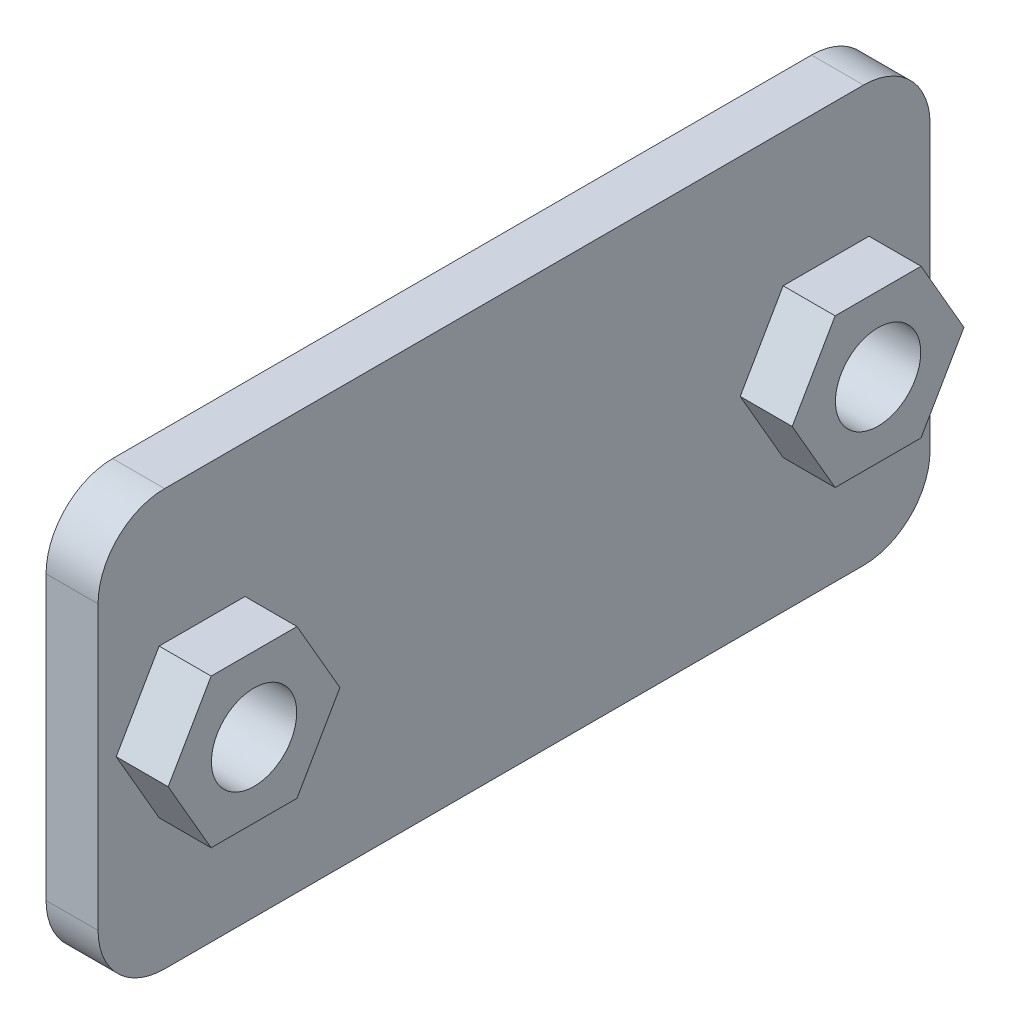
ISO-10303-21;
HEADER;
FILE_DESCRIPTION(('STEP AP214'),'2;1');
FILE_NAME('part.step','',(''),(''),'','','');
FILE_SCHEMA(('AUTOMOTIVE_DESIGN { 1 0 10303 214 1 1 1 1 }'));
ENDSEC;
DATA;
#1=APPLICATION_CONTEXT('core data for automotive mechanical design processes');
#2=APPLICATION_PROTOCOL_DEFINITION('international standard','automotive_design',2000,#1);
#3=PRODUCT_CONTEXT('',#1,'mechanical');
#4=PRODUCT('Part','Part','',(#3));
#5=PRODUCT_RELATED_PRODUCT_CATEGORY('part','',(#4));
#6=PRODUCT_DEFINITION_FORMATION('','',#4);
#7=PRODUCT_DEFINITION_CONTEXT('part definition',#1,'design');
#8=PRODUCT_DEFINITION('design','',#6,#7);
#9=PRODUCT_DEFINITION_SHAPE('','',#8);
#10=(LENGTH_UNIT() NAMED_UNIT(*) SI_UNIT(.MILLI.,.METRE.));
#11=(NAMED_UNIT(*) PLANE_ANGLE_UNIT() SI_UNIT($,.RADIAN.));
#12=(NAMED_UNIT(*) SI_UNIT($,.STERADIAN.) SOLID_ANGLE_UNIT());
#13=UNCERTAINTY_MEASURE_WITH_UNIT(LENGTH_MEASURE(1.E-05),#10,'distance_accuracy_value','');
#14=(GEOMETRIC_REPRESENTATION_CONTEXT(3) GLOBAL_UNCERTAINTY_ASSIGNED_CONTEXT((#13)) GLOBAL_UNIT_ASSIGNED_CONTEXT((#10,
#11,#12)) REPRESENTATION_CONTEXT('',''));
#15=CARTESIAN_POINT('',(0.,0.,0.));
#16=DIRECTION('',(0.,0.,1.));
#17=DIRECTION('',(1.,0.,0.));
#18=AXIS2_PLACEMENT_3D('',#15,#16,#17);
#19=CARTESIAN_POINT('',(5.,0.,0.));
#20=DIRECTION('',(1.,0.,0.));
#21=DIRECTION('',(0.,0.,-1.));
#22=AXIS2_PLACEMENT_3D('',#19,#20,#21);
#23=PLANE('',#22);
#24=DIRECTION('',(0.,0.866025403784439,0.5));
#25=VECTOR('',#24,1.);
#26=CARTESIAN_POINT('',(5.,0.,21.7438911505884));
#27=LINE('',#26,#25);
#28=CARTESIAN_POINT('',(5.,0.,21.7438911505884));
#29=VERTEX_POINT('',#28);
#30=CARTESIAN_POINT('',(5.,7.15000000000001,25.8719455752942));
#31=VERTEX_POINT('',#30);
#32=EDGE_CURVE('E200',#29,#31,#27,.T.);
#33=ORIENTED_EDGE('',*,*,#32,.F.);
#34=DIRECTION('',(0.,0.866025403784439,-0.5));
#35=VECTOR('',#34,1.);
#36=CARTESIAN_POINT('',(5.,-7.15,25.8719455752942));
#37=LINE('',#36,#35);
#38=CARTESIAN_POINT('',(5.,-7.15,25.8719455752942));
#39=VERTEX_POINT('',#38);
#40=EDGE_CURVE('E197',#39,#29,#37,.T.);
#41=ORIENTED_EDGE('',*,*,#40,.F.);
#42=DIRECTION('',(0.,0.,-1.));
#43=VECTOR('',#42,1.);
#44=CARTESIAN_POINT('',(5.,-7.15,34.1280544247058));
#45=LINE('',#44,#43);
#46=CARTESIAN_POINT('',(5.,-7.15,34.1280544247058));
#47=VERTEX_POINT('',#46);
#48=EDGE_CURVE('E210',#47,#39,#45,.T.);
#49=ORIENTED_EDGE('',*,*,#48,.F.);
#50=DIRECTION('',(0.,-0.866025403784439,-0.5));
#51=VECTOR('',#50,1.);
#52=CARTESIAN_POINT('',(5.,0.,38.2561088494116));
#53=LINE('',#52,#51);
#54=CARTESIAN_POINT('',(5.,0.,38.2561088494116));
#55=VERTEX_POINT('',#54);
#56=EDGE_CURVE('E226',#55,#47,#53,.T.);
#57=ORIENTED_EDGE('',*,*,#56,.F.);
#58=DIRECTION('',(0.,-0.866025403784439,0.5));
#59=VECTOR('',#58,1.);
#60=CARTESIAN_POINT('',(5.,7.15000000000001,34.1280544247058));
#61=LINE('',#60,#59);
#62=CARTESIAN_POINT('',(5.,7.15000000000001,34.1280544247058));
#63=VERTEX_POINT('',#62);
#64=EDGE_CURVE('E224',#63,#55,#61,.T.);
#65=ORIENTED_EDGE('',*,*,#64,.F.);
#66=DIRECTION('',(0.,0.,1.));
#67=VECTOR('',#66,1.);
#68=CARTESIAN_POINT('',(5.,7.15000000000001,25.8719455752942));
#69=LINE('',#68,#67);
#70=EDGE_CURVE('E222',#31,#63,#69,.T.);
#71=ORIENTED_EDGE('',*,*,#70,.F.);
#72=EDGE_LOOP('',(#33,#41,#49,#57,#65,#71));
#73=FACE_BOUND('',#72,.T.);
#74=DIRECTION('',(0.,1.,0.));
#75=VECTOR('',#74,1.);
#76=CARTESIAN_POINT('',(5.,20.,-40.));
#77=LINE('',#76,#75);
#78=CARTESIAN_POINT('',(5.,-13.6,-40.));
#79=VERTEX_POINT('',#78);
#80=CARTESIAN_POINT('',(5.,13.6,-40.));
#81=VERTEX_POINT('',#80);
#82=EDGE_CURVE('E244',#79,#81,#77,.T.);
#83=ORIENTED_EDGE('',*,*,#82,.T.);
#84=CARTESIAN_POINT('',(5.,13.6,-33.6));
#85=DIRECTION('',(1.,0.,0.));
#86=DIRECTION('',(0.,0.,-1.));
#87=AXIS2_PLACEMENT_3D('',#84,#85,#86);
#88=CIRCLE('',#87,6.4);
#89=CARTESIAN_POINT('',(5.,20.,-33.6));
#90=VERTEX_POINT('',#89);
#91=EDGE_CURVE('E293',#81,#90,#88,.T.);
#92=ORIENTED_EDGE('',*,*,#91,.T.);
#93=DIRECTION('',(0.,0.,1.));
#94=VECTOR('',#93,1.);
#95=CARTESIAN_POINT('',(5.,20.,40.));
#96=LINE('',#95,#94);
#97=CARTESIAN_POINT('',(5.,20.,33.6));
#98=VERTEX_POINT('',#97);
#99=EDGE_CURVE('E247',#90,#98,#96,.T.);
#100=ORIENTED_EDGE('',*,*,#99,.T.);
#101=CARTESIAN_POINT('',(5.,13.6,33.6));
#102=DIRECTION('',(1.,0.,0.));
#103=DIRECTION('',(0.,0.,-1.));
#104=AXIS2_PLACEMENT_3D('',#101,#102,#103);
#105=CIRCLE('',#104,6.4);
#106=CARTESIAN_POINT('',(5.,13.6,40.));
#107=VERTEX_POINT('',#106);
#108=EDGE_CURVE('E287',#98,#107,#105,.T.);
#109=ORIENTED_EDGE('',*,*,#108,.T.);
#110=DIRECTION('',(0.,-1.,0.));
#111=VECTOR('',#110,1.);
#112=CARTESIAN_POINT('',(5.,20.,40.));
#113=LINE('',#112,#111);
#114=CARTESIAN_POINT('',(5.,-13.6,40.));
#115=VERTEX_POINT('',#114);
#116=EDGE_CURVE('E251',#107,#115,#113,.T.);
#117=ORIENTED_EDGE('',*,*,#116,.T.);
#118=CARTESIAN_POINT('',(5.,-13.6,33.6));
#119=DIRECTION('',(1.,0.,0.));
#120=DIRECTION('',(0.,0.,-1.));
#121=AXIS2_PLACEMENT_3D('',#118,#119,#120);
#122=CIRCLE('',#121,6.4);
#123=CARTESIAN_POINT('',(5.,-20.,33.6));
#124=VERTEX_POINT('',#123);
#125=EDGE_CURVE('E289',#115,#124,#122,.T.);
#126=ORIENTED_EDGE('',*,*,#125,.T.);
#127=DIRECTION('',(0.,0.,-1.));
#128=VECTOR('',#127,1.);
#129=CARTESIAN_POINT('',(5.,-20.,40.));
#130=LINE('',#129,#128);
#131=CARTESIAN_POINT('',(5.,-20.,-33.6));
#132=VERTEX_POINT('',#131);
#133=EDGE_CURVE('E254',#124,#132,#130,.T.);
#134=ORIENTED_EDGE('',*,*,#133,.T.);
#135=CARTESIAN_POINT('',(5.,-13.6,-33.6));
#136=DIRECTION('',(1.,0.,0.));
#137=DIRECTION('',(0.,0.,-1.));
#138=AXIS2_PLACEMENT_3D('',#135,#136,#137);
#139=CIRCLE('',#138,6.4);
#140=EDGE_CURVE('E291',#132,#79,#139,.T.);
#141=ORIENTED_EDGE('',*,*,#140,.T.);
#142=EDGE_LOOP('',(#83,#92,#100,#109,#117,#126,#134,#141));
#143=FACE_BOUND('',#142,.T.);
#144=DIRECTION('',(0.,-0.866025403784439,-0.5));
#145=VECTOR('',#144,1.);
#146=CARTESIAN_POINT('',(5.,0.,-21.7438911505884));
#147=LINE('',#146,#145);
#148=CARTESIAN_POINT('',(5.,0.,-21.7438911505884));
#149=VERTEX_POINT('',#148);
#150=CARTESIAN_POINT('',(5.,-7.15,-25.8719455752942));
#151=VERTEX_POINT('',#150);
#152=EDGE_CURVE('E312',#149,#151,#147,.T.);
#153=ORIENTED_EDGE('',*,*,#152,.F.);
#154=DIRECTION('',(0.,-0.866025403784439,0.499999999999999));
#155=VECTOR('',#154,1.);
#156=CARTESIAN_POINT('',(5.,7.15,-25.8719455752942));
#157=LINE('',#156,#155);
#158=CARTESIAN_POINT('',(5.,7.15,-25.8719455752942));
#159=VERTEX_POINT('',#158);
#160=EDGE_CURVE('E195',#159,#149,#157,.T.);
#161=ORIENTED_EDGE('',*,*,#160,.F.);
#162=DIRECTION('',(0.,0.,1.));
#163=VECTOR('',#162,1.);
#164=CARTESIAN_POINT('',(5.,7.15,-34.1280544247058));
#165=LINE('',#164,#163);
#166=CARTESIAN_POINT('',(5.,7.15,-34.1280544247058));
#167=VERTEX_POINT('',#166);
#168=EDGE_CURVE('E191',#167,#159,#165,.T.);
#169=ORIENTED_EDGE('',*,*,#168,.F.);
#170=DIRECTION('',(0.,0.866025403784439,0.5));
#171=VECTOR('',#170,1.);
#172=CARTESIAN_POINT('',(5.,0.,-38.2561088494116));
#173=LINE('',#172,#171);
#174=CARTESIAN_POINT('',(5.,0.,-38.2561088494116));
#175=VERTEX_POINT('',#174);
#176=EDGE_CURVE('E322',#175,#167,#173,.T.);
#177=ORIENTED_EDGE('',*,*,#176,.F.);
#178=DIRECTION('',(0.,0.866025403784439,-0.5));
#179=VECTOR('',#178,1.);
#180=CARTESIAN_POINT('',(5.,-7.15,-34.1280544247058));
#181=LINE('',#180,#179);
#182=CARTESIAN_POINT('',(5.,-7.15,-34.1280544247058));
#183=VERTEX_POINT('',#182);
#184=EDGE_CURVE('E320',#183,#175,#181,.T.);
#185=ORIENTED_EDGE('',*,*,#184,.F.);
#186=DIRECTION('',(0.,0.,-1.));
#187=VECTOR('',#186,1.);
#188=CARTESIAN_POINT('',(5.,-7.15,-25.8719455752942));
#189=LINE('',#188,#187);
#190=EDGE_CURVE('E314',#151,#183,#189,.T.);
#191=ORIENTED_EDGE('',*,*,#190,.F.);
#192=EDGE_LOOP('',(#153,#161,#169,#177,#185,#191));
#193=FACE_BOUND('',#192,.T.);
#194=ADVANCED_FACE('F33',(#73,#143,#193),#23,.T.);
#195=CARTESIAN_POINT('',(5.,20.,-40.));
#196=DIRECTION('',(0.,0.,1.));
#197=DIRECTION('',(1.,0.,0.));
#198=AXIS2_PLACEMENT_3D('',#195,#196,#197);
#199=PLANE('',#198);
#200=DIRECTION('',(0.,1.,0.));
#201=VECTOR('',#200,1.);
#202=CARTESIAN_POINT('',(0.,20.,-40.));
#203=LINE('',#202,#201);
#204=CARTESIAN_POINT('',(0.,-13.6,-40.));
#205=VERTEX_POINT('',#204);
#206=CARTESIAN_POINT('',(0.,13.6,-40.));
#207=VERTEX_POINT('',#206);
#208=EDGE_CURVE('E258',#205,#207,#203,.T.);
#209=ORIENTED_EDGE('',*,*,#208,.T.);
#210=DIRECTION('',(-1.,0.,0.));
#211=VECTOR('',#210,1.);
#212=CARTESIAN_POINT('',(5.,13.6,-40.));
#213=LINE('',#212,#211);
#214=EDGE_CURVE('E285',#207,#81,#213,.F.);
#215=ORIENTED_EDGE('',*,*,#214,.T.);
#216=ORIENTED_EDGE('',*,*,#82,.F.);
#217=DIRECTION('',(-1.,0.,0.));
#218=VECTOR('',#217,1.);
#219=CARTESIAN_POINT('',(5.,-13.6,-40.));
#220=LINE('',#219,#218);
#221=EDGE_CURVE('E282',#79,#205,#220,.T.);
#222=ORIENTED_EDGE('',*,*,#221,.T.);
#223=EDGE_LOOP('',(#209,#215,#216,#222));
#224=FACE_BOUND('',#223,.T.);
#225=ADVANCED_FACE('F359',(#224),#199,.F.);
#226=CARTESIAN_POINT('',(5.,20.,40.));
#227=DIRECTION('',(0.,-1.,0.));
#228=DIRECTION('',(0.,0.,-1.));
#229=AXIS2_PLACEMENT_3D('',#226,#227,#228);
#230=PLANE('',#229);
#231=ORIENTED_EDGE('',*,*,#99,.F.);
#232=DIRECTION('',(-1.,0.,0.));
#233=VECTOR('',#232,1.);
#234=CARTESIAN_POINT('',(5.,20.,-33.6));
#235=LINE('',#234,#233);
#236=CARTESIAN_POINT('',(0.,20.,-33.6));
#237=VERTEX_POINT('',#236);
#238=EDGE_CURVE('E271',#90,#237,#235,.T.);
#239=ORIENTED_EDGE('',*,*,#238,.T.);
#240=DIRECTION('',(0.,0.,1.));
#241=VECTOR('',#240,1.);
#242=CARTESIAN_POINT('',(0.,20.,40.));
#243=LINE('',#242,#241);
#244=CARTESIAN_POINT('',(0.,20.,33.6));
#245=VERTEX_POINT('',#244);
#246=EDGE_CURVE('E261',#237,#245,#243,.T.);
#247=ORIENTED_EDGE('',*,*,#246,.T.);
#248=DIRECTION('',(-1.,0.,0.));
#249=VECTOR('',#248,1.);
#250=CARTESIAN_POINT('',(5.,20.,33.6));
#251=LINE('',#250,#249);
#252=EDGE_CURVE('E257',#245,#98,#251,.F.);
#253=ORIENTED_EDGE('',*,*,#252,.T.);
#254=EDGE_LOOP('',(#231,#239,#247,#253));
#255=FACE_BOUND('',#254,.T.);
#256=ADVANCED_FACE('F365',(#255),#230,.F.);
#257=CARTESIAN_POINT('',(5.,20.,40.));
#258=DIRECTION('',(0.,0.,-1.));
#259=DIRECTION('',(0.,1.,0.));
#260=AXIS2_PLACEMENT_3D('',#257,#258,#259);
#261=PLANE('',#260);
#262=DIRECTION('',(0.,-1.,0.));
#263=VECTOR('',#262,1.);
#264=CARTESIAN_POINT('',(0.,20.,40.));
#265=LINE('',#264,#263);
#266=CARTESIAN_POINT('',(0.,13.6,40.));
#267=VERTEX_POINT('',#266);
#268=CARTESIAN_POINT('',(0.,-13.6,40.));
#269=VERTEX_POINT('',#268);
#270=EDGE_CURVE('E265',#267,#269,#265,.T.);
#271=ORIENTED_EDGE('',*,*,#270,.T.);
#272=DIRECTION('',(-1.,0.,0.));
#273=VECTOR('',#272,1.);
#274=CARTESIAN_POINT('',(5.,-13.6,40.));
#275=LINE('',#274,#273);
#276=EDGE_CURVE('E11',#269,#115,#275,.F.);
#277=ORIENTED_EDGE('',*,*,#276,.T.);
#278=ORIENTED_EDGE('',*,*,#116,.F.);
#279=DIRECTION('',(-1.,0.,0.));
#280=VECTOR('',#279,1.);
#281=CARTESIAN_POINT('',(5.,13.6,40.));
#282=LINE('',#281,#280);
#283=EDGE_CURVE('E42',#107,#267,#282,.T.);
#284=ORIENTED_EDGE('',*,*,#283,.T.);
#285=EDGE_LOOP('',(#271,#277,#278,#284));
#286=FACE_BOUND('',#285,.T.);
#287=ADVANCED_FACE('F382',(#286),#261,.F.);
#288=CARTESIAN_POINT('',(5.,-20.,40.));
#289=DIRECTION('',(0.,1.,0.));
#290=DIRECTION('',(0.,0.,1.));
#291=AXIS2_PLACEMENT_3D('',#288,#289,#290);
#292=PLANE('',#291);
#293=DIRECTION('',(0.,0.,-1.));
#294=VECTOR('',#293,1.);
#295=CARTESIAN_POINT('',(0.,-20.,40.));
#296=LINE('',#295,#294);
#297=CARTESIAN_POINT('',(0.,-20.,33.6));
#298=VERTEX_POINT('',#297);
#299=CARTESIAN_POINT('',(0.,-20.,-33.6));
#300=VERTEX_POINT('',#299);
#301=EDGE_CURVE('E248',#298,#300,#296,.T.);
#302=ORIENTED_EDGE('',*,*,#301,.T.);
#303=DIRECTION('',(-1.,0.,0.));
#304=VECTOR('',#303,1.);
#305=CARTESIAN_POINT('',(5.,-20.,-33.6));
#306=LINE('',#305,#304);
#307=EDGE_CURVE('E298',#300,#132,#306,.F.);
#308=ORIENTED_EDGE('',*,*,#307,.T.);
#309=ORIENTED_EDGE('',*,*,#133,.F.);
#310=DIRECTION('',(-1.,0.,0.));
#311=VECTOR('',#310,1.);
#312=CARTESIAN_POINT('',(5.,-20.,33.6));
#313=LINE('',#312,#311);
#314=EDGE_CURVE('E295',#124,#298,#313,.T.);
#315=ORIENTED_EDGE('',*,*,#314,.T.);
#316=EDGE_LOOP('',(#302,#308,#309,#315));
#317=FACE_BOUND('',#316,.T.);
#318=ADVANCED_FACE('F378',(#317),#292,.F.);
#319=CARTESIAN_POINT('',(0.,0.,0.));
#320=DIRECTION('',(1.,0.,0.));
#321=DIRECTION('',(0.,0.,-1.));
#322=AXIS2_PLACEMENT_3D('',#319,#320,#321);
#323=PLANE('',#322);
#324=CARTESIAN_POINT('',(0.,0.,30.));
#325=DIRECTION('',(1.,0.,0.));
#326=DIRECTION('',(0.,0.,-1.));
#327=AXIS2_PLACEMENT_3D('',#324,#325,#326);
#328=CIRCLE('',#327,4.1);
#329=CARTESIAN_POINT('',(0.,0.,25.9));
#330=VERTEX_POINT('',#329);
#331=EDGE_CURVE('E262',#330,#330,#328,.T.);
#332=ORIENTED_EDGE('',*,*,#331,.T.);
#333=EDGE_LOOP('',(#332));
#334=FACE_BOUND('',#333,.T.);
#335=CARTESIAN_POINT('',(0.,0.,-30.));
#336=DIRECTION('',(1.,0.,0.));
#337=DIRECTION('',(0.,0.,-1.));
#338=AXIS2_PLACEMENT_3D('',#335,#336,#337);
#339=CIRCLE('',#338,4.1);
#340=CARTESIAN_POINT('',(0.,0.,-34.1));
#341=VERTEX_POINT('',#340);
#342=EDGE_CURVE('E243',#341,#341,#339,.T.);
#343=ORIENTED_EDGE('',*,*,#342,.T.);
#344=EDGE_LOOP('',(#343));
#345=FACE_BOUND('',#344,.T.);
#346=ORIENTED_EDGE('',*,*,#246,.F.);
#347=CARTESIAN_POINT('',(0.,13.6,-33.6));
#348=DIRECTION('',(1.,0.,0.));
#349=DIRECTION('',(0.,0.,-1.));
#350=AXIS2_PLACEMENT_3D('',#347,#348,#349);
#351=CIRCLE('',#350,6.4);
#352=EDGE_CURVE('E280',#237,#207,#351,.F.);
#353=ORIENTED_EDGE('',*,*,#352,.T.);
#354=ORIENTED_EDGE('',*,*,#208,.F.);
#355=CARTESIAN_POINT('',(0.,-13.6,-33.6));
#356=DIRECTION('',(1.,0.,0.));
#357=DIRECTION('',(0.,0.,-1.));
#358=AXIS2_PLACEMENT_3D('',#355,#356,#357);
#359=CIRCLE('',#358,6.4);
#360=EDGE_CURVE('E278',#205,#300,#359,.F.);
#361=ORIENTED_EDGE('',*,*,#360,.T.);
#362=ORIENTED_EDGE('',*,*,#301,.F.);
#363=CARTESIAN_POINT('',(0.,-13.6,33.6));
#364=DIRECTION('',(1.,0.,0.));
#365=DIRECTION('',(0.,0.,-1.));
#366=AXIS2_PLACEMENT_3D('',#363,#364,#365);
#367=CIRCLE('',#366,6.4);
#368=EDGE_CURVE('E276',#298,#269,#367,.F.);
#369=ORIENTED_EDGE('',*,*,#368,.T.);
#370=ORIENTED_EDGE('',*,*,#270,.F.);
#371=CARTESIAN_POINT('',(0.,13.6,33.6));
#372=DIRECTION('',(1.,0.,0.));
#373=DIRECTION('',(0.,0.,-1.));
#374=AXIS2_PLACEMENT_3D('',#371,#372,#373);
#375=CIRCLE('',#374,6.4);
#376=EDGE_CURVE('E274',#267,#245,#375,.F.);
#377=ORIENTED_EDGE('',*,*,#376,.T.);
#378=EDGE_LOOP('',(#346,#353,#354,#361,#362,#369,#370,#377));
#379=FACE_BOUND('',#378,.T.);
#380=ADVANCED_FACE('F374',(#334,#345,#379),#323,.F.);
#381=CARTESIAN_POINT('',(5.,13.6,-33.6));
#382=DIRECTION('',(-1.,0.,0.));
#383=DIRECTION('',(0.,0.,1.));
#384=AXIS2_PLACEMENT_3D('',#381,#382,#383);
#385=CYLINDRICAL_SURFACE('',#384,6.4);
#386=ORIENTED_EDGE('',*,*,#91,.F.);
#387=ORIENTED_EDGE('',*,*,#214,.F.);
#388=ORIENTED_EDGE('',*,*,#352,.F.);
#389=ORIENTED_EDGE('',*,*,#238,.F.);
#390=EDGE_LOOP('',(#386,#387,#388,#389));
#391=FACE_BOUND('',#390,.T.);
#392=ADVANCED_FACE('F377',(#391),#385,.T.);
#393=CARTESIAN_POINT('',(5.,-13.6,-33.6));
#394=DIRECTION('',(-1.,0.,0.));
#395=DIRECTION('',(0.,0.,1.));
#396=AXIS2_PLACEMENT_3D('',#393,#394,#395);
#397=CYLINDRICAL_SURFACE('',#396,6.4);
#398=ORIENTED_EDGE('',*,*,#140,.F.);
#399=ORIENTED_EDGE('',*,*,#307,.F.);
#400=ORIENTED_EDGE('',*,*,#360,.F.);
#401=ORIENTED_EDGE('',*,*,#221,.F.);
#402=EDGE_LOOP('',(#398,#399,#400,#401));
#403=FACE_BOUND('',#402,.T.);
#404=ADVANCED_FACE('F392',(#403),#397,.T.);
#405=CARTESIAN_POINT('',(5.,-13.6,33.6));
#406=DIRECTION('',(-1.,0.,0.));
#407=DIRECTION('',(0.,0.,1.));
#408=AXIS2_PLACEMENT_3D('',#405,#406,#407);
#409=CYLINDRICAL_SURFACE('',#408,6.4);
#410=ORIENTED_EDGE('',*,*,#125,.F.);
#411=ORIENTED_EDGE('',*,*,#276,.F.);
#412=ORIENTED_EDGE('',*,*,#368,.F.);
#413=ORIENTED_EDGE('',*,*,#314,.F.);
#414=EDGE_LOOP('',(#410,#411,#412,#413));
#415=FACE_BOUND('',#414,.T.);
#416=ADVANCED_FACE('F395',(#415),#409,.T.);
#417=CARTESIAN_POINT('',(5.,13.6,33.6));
#418=DIRECTION('',(-1.,0.,0.));
#419=DIRECTION('',(0.,0.,1.));
#420=AXIS2_PLACEMENT_3D('',#417,#418,#419);
#421=CYLINDRICAL_SURFACE('',#420,6.4);
#422=ORIENTED_EDGE('',*,*,#108,.F.);
#423=ORIENTED_EDGE('',*,*,#252,.F.);
#424=ORIENTED_EDGE('',*,*,#376,.F.);
#425=ORIENTED_EDGE('',*,*,#283,.F.);
#426=EDGE_LOOP('',(#422,#423,#424,#425));
#427=FACE_BOUND('',#426,.T.);
#428=ADVANCED_FACE('F35',(#427),#421,.T.);
#429=CARTESIAN_POINT('',(-5.,0.,-30.));
#430=DIRECTION('',(1.,0.,0.));
#431=DIRECTION('',(0.,0.,-1.));
#432=AXIS2_PLACEMENT_3D('',#429,#430,#431);
#433=CYLINDRICAL_SURFACE('',#432,4.1);
#434=ORIENTED_EDGE('',*,*,#342,.F.);
#435=EDGE_LOOP('',(#434));
#436=FACE_BOUND('',#435,.T.);
#437=CARTESIAN_POINT('',(10.,0.,-30.));
#438=DIRECTION('',(1.,0.,0.));
#439=DIRECTION('',(0.,0.,-1.));
#440=AXIS2_PLACEMENT_3D('',#437,#438,#439);
#441=CIRCLE('',#440,4.1);
#442=CARTESIAN_POINT('',(10.,0.,-34.1));
#443=VERTEX_POINT('',#442);
#444=EDGE_CURVE('E305',#443,#443,#441,.T.);
#445=ORIENTED_EDGE('',*,*,#444,.T.);
#446=EDGE_LOOP('',(#445));
#447=FACE_BOUND('',#446,.T.);
#448=ADVANCED_FACE('F372',(#436,#447),#433,.F.);
#449=CARTESIAN_POINT('',(-5.,0.,30.));
#450=DIRECTION('',(1.,0.,0.));
#451=DIRECTION('',(0.,0.,-1.));
#452=AXIS2_PLACEMENT_3D('',#449,#450,#451);
#453=CYLINDRICAL_SURFACE('',#452,4.1);
#454=ORIENTED_EDGE('',*,*,#331,.F.);
#455=EDGE_LOOP('',(#454));
#456=FACE_BOUND('',#455,.T.);
#457=CARTESIAN_POINT('',(10.,0.,30.));
#458=DIRECTION('',(1.,0.,0.));
#459=DIRECTION('',(0.,0.,-1.));
#460=AXIS2_PLACEMENT_3D('',#457,#458,#459);
#461=CIRCLE('',#460,4.1);
#462=CARTESIAN_POINT('',(10.,0.,25.9));
#463=VERTEX_POINT('',#462);
#464=EDGE_CURVE('E37',#463,#463,#461,.T.);
#465=ORIENTED_EDGE('',*,*,#464,.T.);
#466=EDGE_LOOP('',(#465));
#467=FACE_BOUND('',#466,.T.);
#468=ADVANCED_FACE('F427',(#456,#467),#453,.F.);
#469=CARTESIAN_POINT('',(10.,-7.15,25.8719455752942));
#470=DIRECTION('',(0.,0.5,0.866025403784439));
#471=DIRECTION('',(0.,-0.866025403784439,0.5));
#472=AXIS2_PLACEMENT_3D('',#469,#470,#471);
#473=PLANE('',#472);
#474=ORIENTED_EDGE('',*,*,#40,.T.);
#475=DIRECTION('',(-1.,0.,0.));
#476=VECTOR('',#475,1.);
#477=CARTESIAN_POINT('',(10.,0.,21.7438911505884));
#478=LINE('',#477,#476);
#479=CARTESIAN_POINT('',(10.,0.,21.7438911505884));
#480=VERTEX_POINT('',#479);
#481=EDGE_CURVE('E241',#480,#29,#478,.T.);
#482=ORIENTED_EDGE('',*,*,#481,.F.);
#483=DIRECTION('',(0.,0.866025403784439,-0.5));
#484=VECTOR('',#483,1.);
#485=CARTESIAN_POINT('',(10.,-7.15,25.8719455752942));
#486=LINE('',#485,#484);
#487=CARTESIAN_POINT('',(10.,-7.15,25.8719455752942));
#488=VERTEX_POINT('',#487);
#489=EDGE_CURVE('E206',#488,#480,#486,.T.);
#490=ORIENTED_EDGE('',*,*,#489,.F.);
#491=DIRECTION('',(-1.,0.,0.));
#492=VECTOR('',#491,1.);
#493=CARTESIAN_POINT('',(10.,-7.15,25.8719455752942));
#494=LINE('',#493,#492);
#495=EDGE_CURVE('E219',#488,#39,#494,.T.);
#496=ORIENTED_EDGE('',*,*,#495,.T.);
#497=EDGE_LOOP('',(#474,#482,#490,#496));
#498=FACE_BOUND('',#497,.T.);
#499=ADVANCED_FACE('F432',(#498),#473,.F.);
#500=CARTESIAN_POINT('',(10.,0.,21.7438911505884));
#501=DIRECTION('',(0.,-0.5,0.866025403784439));
#502=DIRECTION('',(0.,-0.866025403784439,-0.5));
#503=AXIS2_PLACEMENT_3D('',#500,#501,#502);
#504=PLANE('',#503);
#505=ORIENTED_EDGE('',*,*,#32,.T.);
#506=DIRECTION('',(-1.,0.,0.));
#507=VECTOR('',#506,1.);
#508=CARTESIAN_POINT('',(10.,7.15000000000001,25.8719455752942));
#509=LINE('',#508,#507);
#510=CARTESIAN_POINT('',(10.,7.15000000000001,25.8719455752942));
#511=VERTEX_POINT('',#510);
#512=EDGE_CURVE('E238',#511,#31,#509,.T.);
#513=ORIENTED_EDGE('',*,*,#512,.F.);
#514=DIRECTION('',(0.,0.866025403784439,0.5));
#515=VECTOR('',#514,1.);
#516=CARTESIAN_POINT('',(10.,0.,21.7438911505884));
#517=LINE('',#516,#515);
#518=EDGE_CURVE('E209',#480,#511,#517,.T.);
#519=ORIENTED_EDGE('',*,*,#518,.F.);
#520=ORIENTED_EDGE('',*,*,#481,.T.);
#521=EDGE_LOOP('',(#505,#513,#519,#520));
#522=FACE_BOUND('',#521,.T.);
#523=ADVANCED_FACE('F439',(#522),#504,.F.);
#524=CARTESIAN_POINT('',(10.,7.15000000000001,25.8719455752942));
#525=DIRECTION('',(0.,-1.,0.));
#526=DIRECTION('',(0.,0.,-1.));
#527=AXIS2_PLACEMENT_3D('',#524,#525,#526);
#528=PLANE('',#527);
#529=ORIENTED_EDGE('',*,*,#70,.T.);
#530=DIRECTION('',(-1.,0.,0.));
#531=VECTOR('',#530,1.);
#532=CARTESIAN_POINT('',(10.,7.15000000000001,34.1280544247058));
#533=LINE('',#532,#531);
#534=CARTESIAN_POINT('',(10.,7.15000000000001,34.1280544247058));
#535=VERTEX_POINT('',#534);
#536=EDGE_CURVE('E235',#535,#63,#533,.T.);
#537=ORIENTED_EDGE('',*,*,#536,.F.);
#538=DIRECTION('',(0.,0.,1.));
#539=VECTOR('',#538,1.);
#540=CARTESIAN_POINT('',(10.,7.15000000000001,25.8719455752942));
#541=LINE('',#540,#539);
#542=EDGE_CURVE('E212',#511,#535,#541,.T.);
#543=ORIENTED_EDGE('',*,*,#542,.F.);
#544=ORIENTED_EDGE('',*,*,#512,.T.);
#545=EDGE_LOOP('',(#529,#537,#543,#544));
#546=FACE_BOUND('',#545,.T.);
#547=ADVANCED_FACE('F446',(#546),#528,.F.);
#548=CARTESIAN_POINT('',(10.,7.15000000000001,34.1280544247058));
#549=DIRECTION('',(0.,-0.5,-0.866025403784439));
#550=DIRECTION('',(0.,0.866025403784439,-0.5));
#551=AXIS2_PLACEMENT_3D('',#548,#549,#550);
#552=PLANE('',#551);
#553=ORIENTED_EDGE('',*,*,#64,.T.);
#554=DIRECTION('',(-1.,0.,0.));
#555=VECTOR('',#554,1.);
#556=CARTESIAN_POINT('',(10.,0.,38.2561088494116));
#557=LINE('',#556,#555);
#558=CARTESIAN_POINT('',(10.,0.,38.2561088494116));
#559=VERTEX_POINT('',#558);
#560=EDGE_CURVE('E232',#559,#55,#557,.T.);
#561=ORIENTED_EDGE('',*,*,#560,.F.);
#562=DIRECTION('',(0.,-0.866025403784439,0.5));
#563=VECTOR('',#562,1.);
#564=CARTESIAN_POINT('',(10.,7.15000000000001,34.1280544247058));
#565=LINE('',#564,#563);
#566=EDGE_CURVE('E214',#535,#559,#565,.T.);
#567=ORIENTED_EDGE('',*,*,#566,.F.);
#568=ORIENTED_EDGE('',*,*,#536,.T.);
#569=EDGE_LOOP('',(#553,#561,#567,#568));
#570=FACE_BOUND('',#569,.T.);
#571=ADVANCED_FACE('F450',(#570),#552,.F.);
#572=CARTESIAN_POINT('',(10.,0.,38.2561088494116));
#573=DIRECTION('',(0.,0.5,-0.866025403784439));
#574=DIRECTION('',(0.,0.866025403784439,0.5));
#575=AXIS2_PLACEMENT_3D('',#572,#573,#574);
#576=PLANE('',#575);
#577=ORIENTED_EDGE('',*,*,#56,.T.);
#578=DIRECTION('',(-1.,0.,0.));
#579=VECTOR('',#578,1.);
#580=CARTESIAN_POINT('',(10.,-7.15,34.1280544247058));
#581=LINE('',#580,#579);
#582=CARTESIAN_POINT('',(10.,-7.15,34.1280544247058));
#583=VERTEX_POINT('',#582);
#584=EDGE_CURVE('E58',#583,#47,#581,.T.);
#585=ORIENTED_EDGE('',*,*,#584,.F.);
#586=DIRECTION('',(0.,-0.866025403784439,-0.5));
#587=VECTOR('',#586,1.);
#588=CARTESIAN_POINT('',(10.,0.,38.2561088494116));
#589=LINE('',#588,#587);
#590=EDGE_CURVE('E216',#559,#583,#589,.T.);
#591=ORIENTED_EDGE('',*,*,#590,.F.);
#592=ORIENTED_EDGE('',*,*,#560,.T.);
#593=EDGE_LOOP('',(#577,#585,#591,#592));
#594=FACE_BOUND('',#593,.T.);
#595=ADVANCED_FACE('F454',(#594),#576,.F.);
#596=CARTESIAN_POINT('',(10.,-7.15,34.1280544247058));
#597=DIRECTION('',(0.,1.,0.));
#598=DIRECTION('',(0.,0.,1.));
#599=AXIS2_PLACEMENT_3D('',#596,#597,#598);
#600=PLANE('',#599);
#601=ORIENTED_EDGE('',*,*,#48,.T.);
#602=ORIENTED_EDGE('',*,*,#495,.F.);
#603=DIRECTION('',(0.,0.,-1.));
#604=VECTOR('',#603,1.);
#605=CARTESIAN_POINT('',(10.,-7.15,34.1280544247058));
#606=LINE('',#605,#604);
#607=EDGE_CURVE('E218',#583,#488,#606,.T.);
#608=ORIENTED_EDGE('',*,*,#607,.F.);
#609=ORIENTED_EDGE('',*,*,#584,.T.);
#610=EDGE_LOOP('',(#601,#602,#608,#609));
#611=FACE_BOUND('',#610,.T.);
#612=ADVANCED_FACE('F458',(#611),#600,.F.);
#613=CARTESIAN_POINT('',(10.,0.,0.));
#614=DIRECTION('',(1.,0.,0.));
#615=DIRECTION('',(0.,0.,-1.));
#616=AXIS2_PLACEMENT_3D('',#613,#614,#615);
#617=PLANE('',#616);
#618=ORIENTED_EDGE('',*,*,#464,.F.);
#619=EDGE_LOOP('',(#618));
#620=FACE_BOUND('',#619,.T.);
#621=ORIENTED_EDGE('',*,*,#489,.T.);
#622=ORIENTED_EDGE('',*,*,#518,.T.);
#623=ORIENTED_EDGE('',*,*,#542,.T.);
#624=ORIENTED_EDGE('',*,*,#566,.T.);
#625=ORIENTED_EDGE('',*,*,#590,.T.);
#626=ORIENTED_EDGE('',*,*,#607,.T.);
#627=EDGE_LOOP('',(#621,#622,#623,#624,#625,#626));
#628=FACE_BOUND('',#627,.T.);
#629=ADVANCED_FACE('F462',(#620,#628),#617,.T.);
#630=CARTESIAN_POINT('',(10.,7.15,-25.8719455752942));
#631=DIRECTION('',(0.,-0.499999999999999,-0.866025403784439));
#632=DIRECTION('',(0.,0.866025403784439,-0.499999999999999));
#633=AXIS2_PLACEMENT_3D('',#630,#631,#632);
#634=PLANE('',#633);
#635=ORIENTED_EDGE('',*,*,#160,.T.);
#636=DIRECTION('',(-1.,0.,0.));
#637=VECTOR('',#636,1.);
#638=CARTESIAN_POINT('',(10.,0.,-21.7438911505884));
#639=LINE('',#638,#637);
#640=CARTESIAN_POINT('',(10.,0.,-21.7438911505884));
#641=VERTEX_POINT('',#640);
#642=EDGE_CURVE('E176',#641,#149,#639,.T.);
#643=ORIENTED_EDGE('',*,*,#642,.F.);
#644=DIRECTION('',(0.,-0.866025403784439,0.499999999999999));
#645=VECTOR('',#644,1.);
#646=CARTESIAN_POINT('',(10.,7.15,-25.8719455752942));
#647=LINE('',#646,#645);
#648=CARTESIAN_POINT('',(10.,7.15,-25.8719455752942));
#649=VERTEX_POINT('',#648);
#650=EDGE_CURVE('E183',#649,#641,#647,.T.);
#651=ORIENTED_EDGE('',*,*,#650,.F.);
#652=DIRECTION('',(-1.,0.,0.));
#653=VECTOR('',#652,1.);
#654=CARTESIAN_POINT('',(10.,7.15,-25.8719455752942));
#655=LINE('',#654,#653);
#656=EDGE_CURVE('E325',#649,#159,#655,.T.);
#657=ORIENTED_EDGE('',*,*,#656,.T.);
#658=EDGE_LOOP('',(#635,#643,#651,#657));
#659=FACE_BOUND('',#658,.T.);
#660=ADVANCED_FACE('F193',(#659),#634,.F.);
#661=CARTESIAN_POINT('',(10.,0.,-21.7438911505884));
#662=DIRECTION('',(0.,0.5,-0.866025403784439));
#663=DIRECTION('',(0.,0.866025403784439,0.5));
#664=AXIS2_PLACEMENT_3D('',#661,#662,#663);
#665=PLANE('',#664);
#666=ORIENTED_EDGE('',*,*,#152,.T.);
#667=DIRECTION('',(-1.,0.,0.));
#668=VECTOR('',#667,1.);
#669=CARTESIAN_POINT('',(10.,-7.15,-25.8719455752942));
#670=LINE('',#669,#668);
#671=CARTESIAN_POINT('',(10.,-7.15,-25.8719455752942));
#672=VERTEX_POINT('',#671);
#673=EDGE_CURVE('E179',#672,#151,#670,.T.);
#674=ORIENTED_EDGE('',*,*,#673,.F.);
#675=DIRECTION('',(0.,-0.866025403784439,-0.5));
#676=VECTOR('',#675,1.);
#677=CARTESIAN_POINT('',(10.,0.,-21.7438911505884));
#678=LINE('',#677,#676);
#679=EDGE_CURVE('E172',#641,#672,#678,.T.);
#680=ORIENTED_EDGE('',*,*,#679,.F.);
#681=ORIENTED_EDGE('',*,*,#642,.T.);
#682=EDGE_LOOP('',(#666,#674,#680,#681));
#683=FACE_BOUND('',#682,.T.);
#684=ADVANCED_FACE('F174',(#683),#665,.F.);
#685=CARTESIAN_POINT('',(10.,-7.15,-25.8719455752942));
#686=DIRECTION('',(0.,1.,0.));
#687=DIRECTION('',(0.,0.,1.));
#688=AXIS2_PLACEMENT_3D('',#685,#686,#687);
#689=PLANE('',#688);
#690=ORIENTED_EDGE('',*,*,#190,.T.);
#691=DIRECTION('',(-1.,0.,0.));
#692=VECTOR('',#691,1.);
#693=CARTESIAN_POINT('',(10.,-7.15,-34.1280544247058));
#694=LINE('',#693,#692);
#695=CARTESIAN_POINT('',(10.,-7.15,-34.1280544247058));
#696=VERTEX_POINT('',#695);
#697=EDGE_CURVE('E202',#696,#183,#694,.T.);
#698=ORIENTED_EDGE('',*,*,#697,.F.);
#699=DIRECTION('',(0.,0.,-1.));
#700=VECTOR('',#699,1.);
#701=CARTESIAN_POINT('',(10.,-7.15,-25.8719455752942));
#702=LINE('',#701,#700);
#703=EDGE_CURVE('E182',#672,#696,#702,.T.);
#704=ORIENTED_EDGE('',*,*,#703,.F.);
#705=ORIENTED_EDGE('',*,*,#673,.T.);
#706=EDGE_LOOP('',(#690,#698,#704,#705));
#707=FACE_BOUND('',#706,.T.);
#708=ADVANCED_FACE('F349',(#707),#689,.F.);
#709=CARTESIAN_POINT('',(10.,-7.15,-34.1280544247058));
#710=DIRECTION('',(0.,0.5,0.866025403784439));
#711=DIRECTION('',(0.,-0.866025403784439,0.5));
#712=AXIS2_PLACEMENT_3D('',#709,#710,#711);
#713=PLANE('',#712);
#714=ORIENTED_EDGE('',*,*,#184,.T.);
#715=DIRECTION('',(-1.,0.,0.));
#716=VECTOR('',#715,1.);
#717=CARTESIAN_POINT('',(10.,0.,-38.2561088494116));
#718=LINE('',#717,#716);
#719=CARTESIAN_POINT('',(10.,0.,-38.2561088494116));
#720=VERTEX_POINT('',#719);
#721=EDGE_CURVE('E328',#720,#175,#718,.T.);
#722=ORIENTED_EDGE('',*,*,#721,.F.);
#723=DIRECTION('',(0.,0.866025403784439,-0.5));
#724=VECTOR('',#723,1.);
#725=CARTESIAN_POINT('',(10.,-7.15,-34.1280544247058));
#726=LINE('',#725,#724);
#727=EDGE_CURVE('E337',#696,#720,#726,.T.);
#728=ORIENTED_EDGE('',*,*,#727,.F.);
#729=ORIENTED_EDGE('',*,*,#697,.T.);
#730=EDGE_LOOP('',(#714,#722,#728,#729));
#731=FACE_BOUND('',#730,.T.);
#732=ADVANCED_FACE('F335',(#731),#713,.F.);
#733=CARTESIAN_POINT('',(10.,0.,-38.2561088494116));
#734=DIRECTION('',(0.,-0.5,0.866025403784439));
#735=DIRECTION('',(0.,-0.866025403784439,-0.5));
#736=AXIS2_PLACEMENT_3D('',#733,#734,#735);
#737=PLANE('',#736);
#738=ORIENTED_EDGE('',*,*,#176,.T.);
#739=DIRECTION('',(-1.,0.,0.));
#740=VECTOR('',#739,1.);
#741=CARTESIAN_POINT('',(10.,7.15,-34.1280544247058));
#742=LINE('',#741,#740);
#743=CARTESIAN_POINT('',(10.,7.15,-34.1280544247058));
#744=VERTEX_POINT('',#743);
#745=EDGE_CURVE('E50',#744,#167,#742,.T.);
#746=ORIENTED_EDGE('',*,*,#745,.F.);
#747=DIRECTION('',(0.,0.866025403784439,0.5));
#748=VECTOR('',#747,1.);
#749=CARTESIAN_POINT('',(10.,0.,-38.2561088494116));
#750=LINE('',#749,#748);
#751=EDGE_CURVE('E346',#720,#744,#750,.T.);
#752=ORIENTED_EDGE('',*,*,#751,.F.);
#753=ORIENTED_EDGE('',*,*,#721,.T.);
#754=EDGE_LOOP('',(#738,#746,#752,#753));
#755=FACE_BOUND('',#754,.T.);
#756=ADVANCED_FACE('F344',(#755),#737,.F.);
#757=CARTESIAN_POINT('',(10.,7.15,-34.1280544247058));
#758=DIRECTION('',(0.,-1.,0.));
#759=DIRECTION('',(0.,0.,-1.));
#760=AXIS2_PLACEMENT_3D('',#757,#758,#759);
#761=PLANE('',#760);
#762=ORIENTED_EDGE('',*,*,#168,.T.);
#763=ORIENTED_EDGE('',*,*,#656,.F.);
#764=DIRECTION('',(0.,0.,1.));
#765=VECTOR('',#764,1.);
#766=CARTESIAN_POINT('',(10.,7.15,-34.1280544247058));
#767=LINE('',#766,#765);
#768=EDGE_CURVE('E187',#744,#649,#767,.T.);
#769=ORIENTED_EDGE('',*,*,#768,.F.);
#770=ORIENTED_EDGE('',*,*,#745,.T.);
#771=EDGE_LOOP('',(#762,#763,#769,#770));
#772=FACE_BOUND('',#771,.T.);
#773=ADVANCED_FACE('F495',(#772),#761,.F.);
#774=CARTESIAN_POINT('',(10.,0.,0.));
#775=DIRECTION('',(1.,0.,0.));
#776=DIRECTION('',(0.,0.,-1.));
#777=AXIS2_PLACEMENT_3D('',#774,#775,#776);
#778=PLANE('',#777);
#779=ORIENTED_EDGE('',*,*,#444,.F.);
#780=EDGE_LOOP('',(#779));
#781=FACE_BOUND('',#780,.T.);
#782=ORIENTED_EDGE('',*,*,#650,.T.);
#783=ORIENTED_EDGE('',*,*,#679,.T.);
#784=ORIENTED_EDGE('',*,*,#703,.T.);
#785=ORIENTED_EDGE('',*,*,#727,.T.);
#786=ORIENTED_EDGE('',*,*,#751,.T.);
#787=ORIENTED_EDGE('',*,*,#768,.T.);
#788=EDGE_LOOP('',(#782,#783,#784,#785,#786,#787));
#789=FACE_BOUND('',#788,.T.);
#790=ADVANCED_FACE('F186',(#781,#789),#778,.T.);
#791=CLOSED_SHELL('',(#194,#225,#256,#287,#318,#380,#392,#404,#416,#428,#448,#468,#499,#523,
#547,#571,#595,#612,#629,#660,#684,#708,#732,#756,#773,#790));
#792=MANIFOLD_SOLID_BREP('B2',#791);
#793=ADVANCED_BREP_SHAPE_REPRESENTATION('',(#18,#792),#14);
#794=SHAPE_DEFINITION_REPRESENTATION(#9,#793);
ENDSEC;
END-ISO-10303-21;
